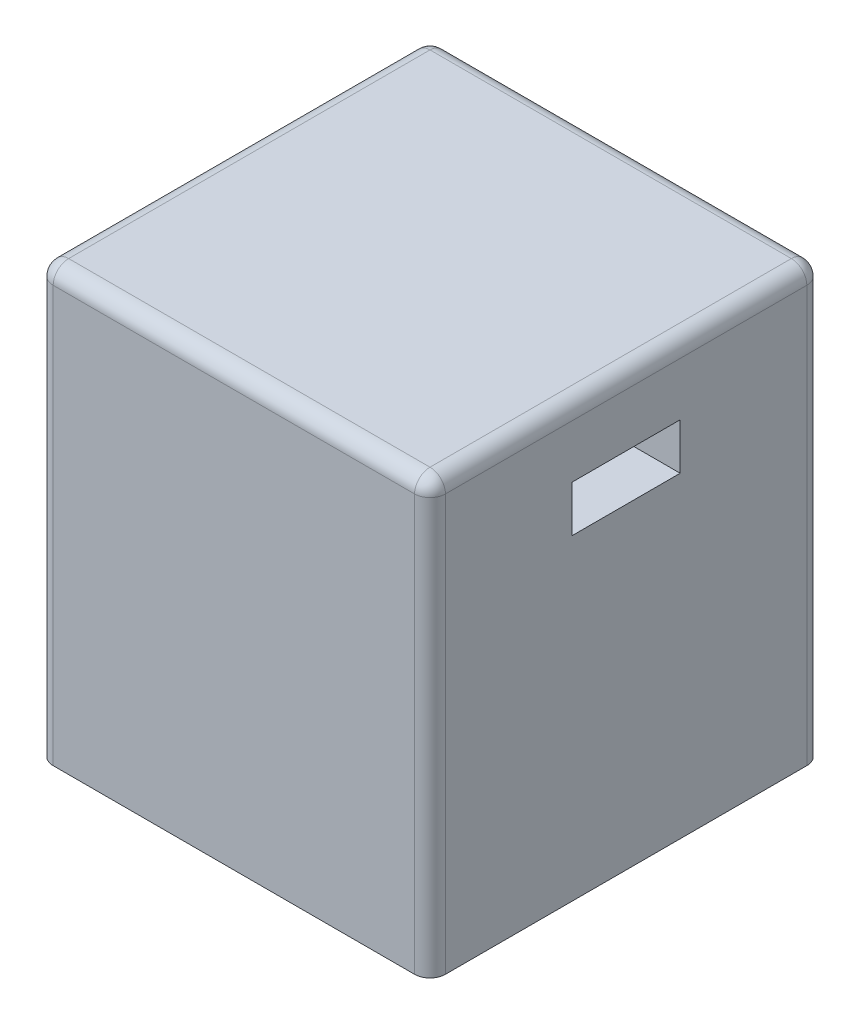
ISO-10303-21;
HEADER;
FILE_DESCRIPTION(('STEP AP214'),'2;1');
FILE_NAME('part.step','',(''),(''),'','','');
FILE_SCHEMA(('AUTOMOTIVE_DESIGN { 1 0 10303 214 1 1 1 1 }'));
ENDSEC;
DATA;
#1=APPLICATION_CONTEXT('core data for automotive mechanical design processes');
#2=APPLICATION_PROTOCOL_DEFINITION('international standard','automotive_design',2000,#1);
#3=PRODUCT_CONTEXT('',#1,'mechanical');
#4=PRODUCT('Part','Part','',(#3));
#5=PRODUCT_RELATED_PRODUCT_CATEGORY('part','',(#4));
#6=PRODUCT_DEFINITION_FORMATION('','',#4);
#7=PRODUCT_DEFINITION_CONTEXT('part definition',#1,'design');
#8=PRODUCT_DEFINITION('design','',#6,#7);
#9=PRODUCT_DEFINITION_SHAPE('','',#8);
#10=(LENGTH_UNIT() NAMED_UNIT(*) SI_UNIT(.MILLI.,.METRE.));
#11=(NAMED_UNIT(*) PLANE_ANGLE_UNIT() SI_UNIT($,.RADIAN.));
#12=(NAMED_UNIT(*) SI_UNIT($,.STERADIAN.) SOLID_ANGLE_UNIT());
#13=UNCERTAINTY_MEASURE_WITH_UNIT(LENGTH_MEASURE(1.E-05),#10,'distance_accuracy_value','');
#14=(GEOMETRIC_REPRESENTATION_CONTEXT(3) GLOBAL_UNCERTAINTY_ASSIGNED_CONTEXT((#13)) GLOBAL_UNIT_ASSIGNED_CONTEXT((#10,
#11,#12)) REPRESENTATION_CONTEXT('',''));
#15=CARTESIAN_POINT('',(0.,0.,0.));
#16=DIRECTION('',(0.,0.,1.));
#17=DIRECTION('',(1.,0.,0.));
#18=AXIS2_PLACEMENT_3D('',#15,#16,#17);
#19=CARTESIAN_POINT('',(12.7,13.97,12.7));
#20=DIRECTION('',(-1.,0.,0.));
#21=DIRECTION('',(0.,0.,1.));
#22=AXIS2_PLACEMENT_3D('',#19,#20,#21);
#23=PLANE('',#22);
#24=DIRECTION('',(0.,0.,-1.));
#25=VECTOR('',#24,1.);
#26=CARTESIAN_POINT('',(12.7,-13.97,12.7));
#27=LINE('',#26,#25);
#28=CARTESIAN_POINT('',(12.7,-13.97,11.7));
#29=VERTEX_POINT('',#28);
#30=CARTESIAN_POINT('',(12.7,-13.97,-11.7));
#31=VERTEX_POINT('',#30);
#32=EDGE_CURVE('E235',#29,#31,#27,.T.);
#33=ORIENTED_EDGE('',*,*,#32,.T.);
#34=DIRECTION('',(0.,-1.,0.));
#35=VECTOR('',#34,1.);
#36=CARTESIAN_POINT('',(12.7,13.97,-11.7));
#37=LINE('',#36,#35);
#38=CARTESIAN_POINT('',(12.7,12.97,-11.7));
#39=VERTEX_POINT('',#38);
#40=EDGE_CURVE('E282',#31,#39,#37,.F.);
#41=ORIENTED_EDGE('',*,*,#40,.T.);
#42=DIRECTION('',(0.,0.,-1.));
#43=VECTOR('',#42,1.);
#44=CARTESIAN_POINT('',(12.7,12.97,12.7));
#45=LINE('',#44,#43);
#46=CARTESIAN_POINT('',(12.7,12.97,11.7));
#47=VERTEX_POINT('',#46);
#48=EDGE_CURVE('E276',#39,#47,#45,.F.);
#49=ORIENTED_EDGE('',*,*,#48,.T.);
#50=DIRECTION('',(0.,-1.,0.));
#51=VECTOR('',#50,1.);
#52=CARTESIAN_POINT('',(12.7,13.97,11.7));
#53=LINE('',#52,#51);
#54=EDGE_CURVE('E279',#47,#29,#53,.T.);
#55=ORIENTED_EDGE('',*,*,#54,.T.);
#56=EDGE_LOOP('',(#33,#41,#49,#55));
#57=FACE_BOUND('',#56,.T.);
#58=DIRECTION('',(0.,0.,1.));
#59=VECTOR('',#58,1.);
#60=CARTESIAN_POINT('',(12.7,9.53,3.5));
#61=LINE('',#60,#59);
#62=CARTESIAN_POINT('',(12.7,9.53,-3.5));
#63=VERTEX_POINT('',#62);
#64=CARTESIAN_POINT('',(12.7,9.53,3.5));
#65=VERTEX_POINT('',#64);
#66=EDGE_CURVE('E192',#63,#65,#61,.T.);
#67=ORIENTED_EDGE('',*,*,#66,.F.);
#68=DIRECTION('',(0.,1.,0.));
#69=VECTOR('',#68,1.);
#70=CARTESIAN_POINT('',(12.7,6.53,-3.5));
#71=LINE('',#70,#69);
#72=CARTESIAN_POINT('',(12.7,6.53,-3.5));
#73=VERTEX_POINT('',#72);
#74=EDGE_CURVE('E158',#73,#63,#71,.T.);
#75=ORIENTED_EDGE('',*,*,#74,.F.);
#76=DIRECTION('',(0.,0.,-1.));
#77=VECTOR('',#76,1.);
#78=CARTESIAN_POINT('',(12.7,6.53,3.5));
#79=LINE('',#78,#77);
#80=CARTESIAN_POINT('',(12.7,6.53,3.5));
#81=VERTEX_POINT('',#80);
#82=EDGE_CURVE('E179',#81,#73,#79,.T.);
#83=ORIENTED_EDGE('',*,*,#82,.F.);
#84=DIRECTION('',(0.,-1.,0.));
#85=VECTOR('',#84,1.);
#86=CARTESIAN_POINT('',(12.7,6.53,3.5));
#87=LINE('',#86,#85);
#88=EDGE_CURVE('E183',#65,#81,#87,.T.);
#89=ORIENTED_EDGE('',*,*,#88,.F.);
#90=EDGE_LOOP('',(#67,#75,#83,#89));
#91=FACE_BOUND('',#90,.T.);
#92=ADVANCED_FACE('F45',(#57,#91),#23,.F.);
#93=CARTESIAN_POINT('',(-12.7,13.97,-12.7));
#94=DIRECTION('',(0.,0.,1.));
#95=DIRECTION('',(1.,0.,0.));
#96=AXIS2_PLACEMENT_3D('',#93,#94,#95);
#97=PLANE('',#96);
#98=DIRECTION('',(-1.,0.,0.));
#99=VECTOR('',#98,1.);
#100=CARTESIAN_POINT('',(-12.7,12.97,-12.7));
#101=LINE('',#100,#99);
#102=CARTESIAN_POINT('',(-11.7,12.97,-12.7));
#103=VERTEX_POINT('',#102);
#104=CARTESIAN_POINT('',(11.7,12.97,-12.7));
#105=VERTEX_POINT('',#104);
#106=EDGE_CURVE('E254',#103,#105,#101,.F.);
#107=ORIENTED_EDGE('',*,*,#106,.T.);
#108=DIRECTION('',(0.,-1.,0.));
#109=VECTOR('',#108,1.);
#110=CARTESIAN_POINT('',(11.7,13.97,-12.7));
#111=LINE('',#110,#109);
#112=CARTESIAN_POINT('',(11.7,-13.97,-12.7));
#113=VERTEX_POINT('',#112);
#114=EDGE_CURVE('E260',#105,#113,#111,.T.);
#115=ORIENTED_EDGE('',*,*,#114,.T.);
#116=DIRECTION('',(-1.,0.,0.));
#117=VECTOR('',#116,1.);
#118=CARTESIAN_POINT('',(-12.7,-13.97,-12.7));
#119=LINE('',#118,#117);
#120=CARTESIAN_POINT('',(-11.7,-13.97,-12.7));
#121=VERTEX_POINT('',#120);
#122=EDGE_CURVE('E242',#113,#121,#119,.T.);
#123=ORIENTED_EDGE('',*,*,#122,.T.);
#124=DIRECTION('',(0.,-1.,0.));
#125=VECTOR('',#124,1.);
#126=CARTESIAN_POINT('',(-11.7,13.97,-12.7));
#127=LINE('',#126,#125);
#128=EDGE_CURVE('E257',#121,#103,#127,.F.);
#129=ORIENTED_EDGE('',*,*,#128,.T.);
#130=EDGE_LOOP('',(#107,#115,#123,#129));
#131=FACE_BOUND('',#130,.T.);
#132=ADVANCED_FACE('F399',(#131),#97,.F.);
#133=CARTESIAN_POINT('',(-12.7,13.97,12.7));
#134=DIRECTION('',(1.,0.,0.));
#135=DIRECTION('',(0.,0.,-1.));
#136=AXIS2_PLACEMENT_3D('',#133,#134,#135);
#137=PLANE('',#136);
#138=DIRECTION('',(0.,0.,-1.));
#139=VECTOR('',#138,1.);
#140=CARTESIAN_POINT('',(-12.7,6.53,3.5));
#141=LINE('',#140,#139);
#142=CARTESIAN_POINT('',(-12.7,6.53,3.5));
#143=VERTEX_POINT('',#142);
#144=CARTESIAN_POINT('',(-12.7,6.53,-3.5));
#145=VERTEX_POINT('',#144);
#146=EDGE_CURVE('E164',#143,#145,#141,.T.);
#147=ORIENTED_EDGE('',*,*,#146,.T.);
#148=DIRECTION('',(0.,1.,0.));
#149=VECTOR('',#148,1.);
#150=CARTESIAN_POINT('',(-12.7,6.53,-3.5));
#151=LINE('',#150,#149);
#152=CARTESIAN_POINT('',(-12.7,9.53,-3.5));
#153=VERTEX_POINT('',#152);
#154=EDGE_CURVE('E155',#145,#153,#151,.T.);
#155=ORIENTED_EDGE('',*,*,#154,.T.);
#156=DIRECTION('',(0.,0.,1.));
#157=VECTOR('',#156,1.);
#158=CARTESIAN_POINT('',(-12.7,9.53,3.5));
#159=LINE('',#158,#157);
#160=CARTESIAN_POINT('',(-12.7,9.53,3.5));
#161=VERTEX_POINT('',#160);
#162=EDGE_CURVE('E168',#153,#161,#159,.T.);
#163=ORIENTED_EDGE('',*,*,#162,.T.);
#164=DIRECTION('',(0.,-1.,0.));
#165=VECTOR('',#164,1.);
#166=CARTESIAN_POINT('',(-12.7,6.53,3.5));
#167=LINE('',#166,#165);
#168=EDGE_CURVE('E173',#161,#143,#167,.T.);
#169=ORIENTED_EDGE('',*,*,#168,.T.);
#170=EDGE_LOOP('',(#147,#155,#163,#169));
#171=FACE_BOUND('',#170,.T.);
#172=DIRECTION('',(0.,0.,1.));
#173=VECTOR('',#172,1.);
#174=CARTESIAN_POINT('',(-12.7,12.97,12.7));
#175=LINE('',#174,#173);
#176=CARTESIAN_POINT('',(-12.7,12.97,11.7));
#177=VERTEX_POINT('',#176);
#178=CARTESIAN_POINT('',(-12.7,12.97,-11.7));
#179=VERTEX_POINT('',#178);
#180=EDGE_CURVE('E285',#177,#179,#175,.F.);
#181=ORIENTED_EDGE('',*,*,#180,.T.);
#182=DIRECTION('',(0.,-1.,0.));
#183=VECTOR('',#182,1.);
#184=CARTESIAN_POINT('',(-12.7,13.97,-11.7));
#185=LINE('',#184,#183);
#186=CARTESIAN_POINT('',(-12.7,-13.97,-11.7));
#187=VERTEX_POINT('',#186);
#188=EDGE_CURVE('E291',#179,#187,#185,.T.);
#189=ORIENTED_EDGE('',*,*,#188,.T.);
#190=DIRECTION('',(0.,0.,1.));
#191=VECTOR('',#190,1.);
#192=CARTESIAN_POINT('',(-12.7,-13.97,12.7));
#193=LINE('',#192,#191);
#194=CARTESIAN_POINT('',(-12.7,-13.97,11.7));
#195=VERTEX_POINT('',#194);
#196=EDGE_CURVE('E246',#187,#195,#193,.T.);
#197=ORIENTED_EDGE('',*,*,#196,.T.);
#198=DIRECTION('',(0.,-1.,0.));
#199=VECTOR('',#198,1.);
#200=CARTESIAN_POINT('',(-12.7,13.97,11.7));
#201=LINE('',#200,#199);
#202=EDGE_CURVE('E288',#195,#177,#201,.F.);
#203=ORIENTED_EDGE('',*,*,#202,.T.);
#204=EDGE_LOOP('',(#181,#189,#197,#203));
#205=FACE_BOUND('',#204,.T.);
#206=ADVANCED_FACE('F175',(#171,#205),#137,.F.);
#207=CARTESIAN_POINT('',(-12.7,13.97,12.7));
#208=DIRECTION('',(0.,0.,-1.));
#209=DIRECTION('',(-1.,0.,0.));
#210=AXIS2_PLACEMENT_3D('',#207,#208,#209);
#211=PLANE('',#210);
#212=DIRECTION('',(1.,0.,0.));
#213=VECTOR('',#212,1.);
#214=CARTESIAN_POINT('',(-12.7,-13.97,12.7));
#215=LINE('',#214,#213);
#216=CARTESIAN_POINT('',(-11.7,-13.97,12.7));
#217=VERTEX_POINT('',#216);
#218=CARTESIAN_POINT('',(11.7,-13.97,12.7));
#219=VERTEX_POINT('',#218);
#220=EDGE_CURVE('E250',#217,#219,#215,.T.);
#221=ORIENTED_EDGE('',*,*,#220,.T.);
#222=DIRECTION('',(0.,-1.,0.));
#223=VECTOR('',#222,1.);
#224=CARTESIAN_POINT('',(11.7,13.97,12.7));
#225=LINE('',#224,#223);
#226=CARTESIAN_POINT('',(11.7,12.97,12.7));
#227=VERTEX_POINT('',#226);
#228=EDGE_CURVE('E300',#219,#227,#225,.F.);
#229=ORIENTED_EDGE('',*,*,#228,.T.);
#230=DIRECTION('',(1.,0.,0.));
#231=VECTOR('',#230,1.);
#232=CARTESIAN_POINT('',(-12.7,12.97,12.7));
#233=LINE('',#232,#231);
#234=CARTESIAN_POINT('',(-11.7,12.97,12.7));
#235=VERTEX_POINT('',#234);
#236=EDGE_CURVE('E294',#227,#235,#233,.F.);
#237=ORIENTED_EDGE('',*,*,#236,.T.);
#238=DIRECTION('',(0.,-1.,0.));
#239=VECTOR('',#238,1.);
#240=CARTESIAN_POINT('',(-11.7,13.97,12.7));
#241=LINE('',#240,#239);
#242=EDGE_CURVE('E297',#235,#217,#241,.T.);
#243=ORIENTED_EDGE('',*,*,#242,.T.);
#244=EDGE_LOOP('',(#221,#229,#237,#243));
#245=FACE_BOUND('',#244,.T.);
#246=ADVANCED_FACE('F365',(#245),#211,.F.);
#247=CARTESIAN_POINT('',(0.,13.97,0.));
#248=DIRECTION('',(0.,-1.,0.));
#249=DIRECTION('',(0.,0.,-1.));
#250=AXIS2_PLACEMENT_3D('',#247,#248,#249);
#251=PLANE('',#250);
#252=DIRECTION('',(1.,0.,0.));
#253=VECTOR('',#252,1.);
#254=CARTESIAN_POINT('',(0.,13.97,11.7));
#255=LINE('',#254,#253);
#256=CARTESIAN_POINT('',(-11.7,13.97,11.7));
#257=VERTEX_POINT('',#256);
#258=CARTESIAN_POINT('',(11.7,13.97,11.7));
#259=VERTEX_POINT('',#258);
#260=EDGE_CURVE('E70',#257,#259,#255,.T.);
#261=ORIENTED_EDGE('',*,*,#260,.T.);
#262=DIRECTION('',(0.,0.,-1.));
#263=VECTOR('',#262,1.);
#264=CARTESIAN_POINT('',(11.7,13.97,0.));
#265=LINE('',#264,#263);
#266=CARTESIAN_POINT('',(11.7,13.97,-11.7));
#267=VERTEX_POINT('',#266);
#268=EDGE_CURVE('E11',#259,#267,#265,.T.);
#269=ORIENTED_EDGE('',*,*,#268,.T.);
#270=DIRECTION('',(-1.,0.,0.));
#271=VECTOR('',#270,1.);
#272=CARTESIAN_POINT('',(0.,13.97,-11.7));
#273=LINE('',#272,#271);
#274=CARTESIAN_POINT('',(-11.7,13.97,-11.7));
#275=VERTEX_POINT('',#274);
#276=EDGE_CURVE('E55',#267,#275,#273,.T.);
#277=ORIENTED_EDGE('',*,*,#276,.T.);
#278=DIRECTION('',(0.,0.,1.));
#279=VECTOR('',#278,1.);
#280=CARTESIAN_POINT('',(-11.7,13.97,0.));
#281=LINE('',#280,#279);
#282=EDGE_CURVE('E303',#275,#257,#281,.T.);
#283=ORIENTED_EDGE('',*,*,#282,.T.);
#284=EDGE_LOOP('',(#261,#269,#277,#283));
#285=FACE_BOUND('',#284,.T.);
#286=ADVANCED_FACE('F386',(#285),#251,.F.);
#287=CARTESIAN_POINT('',(0.,-13.97,0.));
#288=DIRECTION('',(0.,-1.,0.));
#289=DIRECTION('',(0.,0.,-1.));
#290=AXIS2_PLACEMENT_3D('',#287,#288,#289);
#291=PLANE('',#290);
#292=CARTESIAN_POINT('',(-6.35,-13.97,-6.35));
#293=DIRECTION('',(0.,-1.,0.));
#294=DIRECTION('',(0.,0.,-1.));
#295=AXIS2_PLACEMENT_3D('',#292,#293,#294);
#296=CIRCLE('',#295,1.5);
#297=CARTESIAN_POINT('',(-6.35,-13.97,-7.85));
#298=VERTEX_POINT('',#297);
#299=EDGE_CURVE('E224',#298,#298,#296,.T.);
#300=ORIENTED_EDGE('',*,*,#299,.F.);
#301=EDGE_LOOP('',(#300));
#302=FACE_BOUND('',#301,.T.);
#303=CARTESIAN_POINT('',(6.35,-13.97,-6.35));
#304=DIRECTION('',(0.,-1.,0.));
#305=DIRECTION('',(0.,0.,-1.));
#306=AXIS2_PLACEMENT_3D('',#303,#304,#305);
#307=CIRCLE('',#306,1.5);
#308=CARTESIAN_POINT('',(6.35,-13.97,-7.85));
#309=VERTEX_POINT('',#308);
#310=EDGE_CURVE('E216',#309,#309,#307,.T.);
#311=ORIENTED_EDGE('',*,*,#310,.F.);
#312=EDGE_LOOP('',(#311));
#313=FACE_BOUND('',#312,.T.);
#314=CARTESIAN_POINT('',(6.35,-13.97,6.35));
#315=DIRECTION('',(0.,-1.,0.));
#316=DIRECTION('',(0.,0.,-1.));
#317=AXIS2_PLACEMENT_3D('',#314,#315,#316);
#318=CIRCLE('',#317,1.5);
#319=CARTESIAN_POINT('',(6.35,-13.97,4.85));
#320=VERTEX_POINT('',#319);
#321=EDGE_CURVE('E207',#320,#320,#318,.T.);
#322=ORIENTED_EDGE('',*,*,#321,.F.);
#323=EDGE_LOOP('',(#322));
#324=FACE_BOUND('',#323,.T.);
#325=CARTESIAN_POINT('',(-6.35000000000001,-13.97,6.35));
#326=DIRECTION('',(0.,-1.,0.));
#327=DIRECTION('',(0.,0.,-1.));
#328=AXIS2_PLACEMENT_3D('',#325,#326,#327);
#329=CIRCLE('',#328,1.5);
#330=CARTESIAN_POINT('',(-6.35000000000001,-13.97,4.85));
#331=VERTEX_POINT('',#330);
#332=EDGE_CURVE('E211',#331,#331,#329,.T.);
#333=ORIENTED_EDGE('',*,*,#332,.F.);
#334=EDGE_LOOP('',(#333));
#335=FACE_BOUND('',#334,.T.);
#336=ORIENTED_EDGE('',*,*,#122,.F.);
#337=CARTESIAN_POINT('',(11.7,-13.97,-11.7));
#338=DIRECTION('',(0.,-1.,0.));
#339=DIRECTION('',(0.,0.,-1.));
#340=AXIS2_PLACEMENT_3D('',#337,#338,#339);
#341=CIRCLE('',#340,1.);
#342=EDGE_CURVE('E273',#113,#31,#341,.T.);
#343=ORIENTED_EDGE('',*,*,#342,.T.);
#344=ORIENTED_EDGE('',*,*,#32,.F.);
#345=CARTESIAN_POINT('',(11.7,-13.97,11.7));
#346=DIRECTION('',(0.,-1.,0.));
#347=DIRECTION('',(0.,0.,-1.));
#348=AXIS2_PLACEMENT_3D('',#345,#346,#347);
#349=CIRCLE('',#348,1.);
#350=EDGE_CURVE('E267',#29,#219,#349,.T.);
#351=ORIENTED_EDGE('',*,*,#350,.T.);
#352=ORIENTED_EDGE('',*,*,#220,.F.);
#353=CARTESIAN_POINT('',(-11.7,-13.97,11.7));
#354=DIRECTION('',(0.,-1.,0.));
#355=DIRECTION('',(0.,0.,-1.));
#356=AXIS2_PLACEMENT_3D('',#353,#354,#355);
#357=CIRCLE('',#356,1.);
#358=EDGE_CURVE('E264',#217,#195,#357,.T.);
#359=ORIENTED_EDGE('',*,*,#358,.T.);
#360=ORIENTED_EDGE('',*,*,#196,.F.);
#361=CARTESIAN_POINT('',(-11.7,-13.97,-11.7));
#362=DIRECTION('',(0.,-1.,0.));
#363=DIRECTION('',(0.,0.,-1.));
#364=AXIS2_PLACEMENT_3D('',#361,#362,#363);
#365=CIRCLE('',#364,1.);
#366=EDGE_CURVE('E270',#187,#121,#365,.T.);
#367=ORIENTED_EDGE('',*,*,#366,.T.);
#368=EDGE_LOOP('',(#336,#343,#344,#351,#352,#359,#360,#367));
#369=FACE_BOUND('',#368,.T.);
#370=ADVANCED_FACE('F369',(#302,#313,#324,#335,#369),#291,.T.);
#371=CARTESIAN_POINT('',(-6.35000000000001,-8.89,6.35));
#372=DIRECTION('',(0.,-1.,0.));
#373=DIRECTION('',(0.,0.,-1.));
#374=AXIS2_PLACEMENT_3D('',#371,#372,#373);
#375=CYLINDRICAL_SURFACE('',#374,1.5);
#376=CARTESIAN_POINT('',(-6.35000000000001,-8.89,6.35));
#377=DIRECTION('',(0.,-1.,0.));
#378=DIRECTION('',(0.,0.,-1.));
#379=AXIS2_PLACEMENT_3D('',#376,#377,#378);
#380=CIRCLE('',#379,1.5);
#381=CARTESIAN_POINT('',(-6.35000000000001,-8.89,4.85));
#382=VERTEX_POINT('',#381);
#383=EDGE_CURVE('E231',#382,#382,#380,.T.);
#384=ORIENTED_EDGE('',*,*,#383,.F.);
#385=EDGE_LOOP('',(#384));
#386=FACE_BOUND('',#385,.T.);
#387=ORIENTED_EDGE('',*,*,#332,.T.);
#388=EDGE_LOOP('',(#387));
#389=FACE_BOUND('',#388,.T.);
#390=ADVANCED_FACE('F434',(#386,#389),#375,.F.);
#391=CARTESIAN_POINT('',(-6.35000000000001,-8.89,6.35));
#392=DIRECTION('',(0.,-1.,0.));
#393=DIRECTION('',(0.,0.,-1.));
#394=AXIS2_PLACEMENT_3D('',#391,#392,#393);
#395=PLANE('',#394);
#396=ORIENTED_EDGE('',*,*,#383,.T.);
#397=EDGE_LOOP('',(#396));
#398=FACE_BOUND('',#397,.T.);
#399=ADVANCED_FACE('F440',(#398),#395,.T.);
#400=CARTESIAN_POINT('',(6.35,-8.89,6.35));
#401=DIRECTION('',(0.,-1.,0.));
#402=DIRECTION('',(0.,0.,-1.));
#403=AXIS2_PLACEMENT_3D('',#400,#401,#402);
#404=CYLINDRICAL_SURFACE('',#403,1.5);
#405=CARTESIAN_POINT('',(6.35,-8.89,6.35));
#406=DIRECTION('',(0.,-1.,0.));
#407=DIRECTION('',(0.,0.,-1.));
#408=AXIS2_PLACEMENT_3D('',#405,#406,#407);
#409=CIRCLE('',#408,1.5);
#410=CARTESIAN_POINT('',(6.35,-8.89,4.85));
#411=VERTEX_POINT('',#410);
#412=EDGE_CURVE('E212',#411,#411,#409,.T.);
#413=ORIENTED_EDGE('',*,*,#412,.F.);
#414=EDGE_LOOP('',(#413));
#415=FACE_BOUND('',#414,.T.);
#416=ORIENTED_EDGE('',*,*,#321,.T.);
#417=EDGE_LOOP('',(#416));
#418=FACE_BOUND('',#417,.T.);
#419=ADVANCED_FACE('F444',(#415,#418),#404,.F.);
#420=CARTESIAN_POINT('',(6.35,-8.89,6.35));
#421=DIRECTION('',(0.,-1.,0.));
#422=DIRECTION('',(0.,0.,-1.));
#423=AXIS2_PLACEMENT_3D('',#420,#421,#422);
#424=PLANE('',#423);
#425=ORIENTED_EDGE('',*,*,#412,.T.);
#426=EDGE_LOOP('',(#425));
#427=FACE_BOUND('',#426,.T.);
#428=ADVANCED_FACE('F461',(#427),#424,.T.);
#429=CARTESIAN_POINT('',(6.35,-8.89,-6.35));
#430=DIRECTION('',(0.,-1.,0.));
#431=DIRECTION('',(0.,0.,-1.));
#432=AXIS2_PLACEMENT_3D('',#429,#430,#431);
#433=CYLINDRICAL_SURFACE('',#432,1.5);
#434=CARTESIAN_POINT('',(6.35,-8.89,-6.35));
#435=DIRECTION('',(0.,-1.,0.));
#436=DIRECTION('',(0.,0.,-1.));
#437=AXIS2_PLACEMENT_3D('',#434,#435,#436);
#438=CIRCLE('',#437,1.5);
#439=CARTESIAN_POINT('',(6.35,-8.89,-7.85));
#440=VERTEX_POINT('',#439);
#441=EDGE_CURVE('E220',#440,#440,#438,.T.);
#442=ORIENTED_EDGE('',*,*,#441,.F.);
#443=EDGE_LOOP('',(#442));
#444=FACE_BOUND('',#443,.T.);
#445=ORIENTED_EDGE('',*,*,#310,.T.);
#446=EDGE_LOOP('',(#445));
#447=FACE_BOUND('',#446,.T.);
#448=ADVANCED_FACE('F457',(#444,#447),#433,.F.);
#449=CARTESIAN_POINT('',(6.35,-8.89,-6.35));
#450=DIRECTION('',(0.,-1.,0.));
#451=DIRECTION('',(0.,0.,-1.));
#452=AXIS2_PLACEMENT_3D('',#449,#450,#451);
#453=PLANE('',#452);
#454=ORIENTED_EDGE('',*,*,#441,.T.);
#455=EDGE_LOOP('',(#454));
#456=FACE_BOUND('',#455,.T.);
#457=ADVANCED_FACE('F453',(#456),#453,.T.);
#458=CARTESIAN_POINT('',(-6.35,-8.89,-6.35));
#459=DIRECTION('',(0.,-1.,0.));
#460=DIRECTION('',(0.,0.,-1.));
#461=AXIS2_PLACEMENT_3D('',#458,#459,#460);
#462=CYLINDRICAL_SURFACE('',#461,1.5);
#463=CARTESIAN_POINT('',(-6.35,-8.89,-6.35));
#464=DIRECTION('',(0.,-1.,0.));
#465=DIRECTION('',(0.,0.,-1.));
#466=AXIS2_PLACEMENT_3D('',#463,#464,#465);
#467=CIRCLE('',#466,1.5);
#468=CARTESIAN_POINT('',(-6.35,-8.89,-7.85));
#469=VERTEX_POINT('',#468);
#470=EDGE_CURVE('E201',#469,#469,#467,.T.);
#471=ORIENTED_EDGE('',*,*,#470,.F.);
#472=EDGE_LOOP('',(#471));
#473=FACE_BOUND('',#472,.T.);
#474=ORIENTED_EDGE('',*,*,#299,.T.);
#475=EDGE_LOOP('',(#474));
#476=FACE_BOUND('',#475,.T.);
#477=ADVANCED_FACE('F449',(#473,#476),#462,.F.);
#478=CARTESIAN_POINT('',(-6.35,-8.89,-6.35));
#479=DIRECTION('',(0.,-1.,0.));
#480=DIRECTION('',(0.,0.,-1.));
#481=AXIS2_PLACEMENT_3D('',#478,#479,#480);
#482=PLANE('',#481);
#483=ORIENTED_EDGE('',*,*,#470,.T.);
#484=EDGE_LOOP('',(#483));
#485=FACE_BOUND('',#484,.T.);
#486=ADVANCED_FACE('F446',(#485),#482,.T.);
#487=CARTESIAN_POINT('',(-12.7,6.53,-3.5));
#488=DIRECTION('',(0.,0.,-1.));
#489=DIRECTION('',(0.,1.,0.));
#490=AXIS2_PLACEMENT_3D('',#487,#488,#489);
#491=PLANE('',#490);
#492=ORIENTED_EDGE('',*,*,#74,.T.);
#493=DIRECTION('',(1.,0.,0.));
#494=VECTOR('',#493,1.);
#495=CARTESIAN_POINT('',(-12.7,9.53,-3.5));
#496=LINE('',#495,#494);
#497=EDGE_CURVE('E151',#153,#63,#496,.T.);
#498=ORIENTED_EDGE('',*,*,#497,.F.);
#499=ORIENTED_EDGE('',*,*,#154,.F.);
#500=DIRECTION('',(1.,0.,0.));
#501=VECTOR('',#500,1.);
#502=CARTESIAN_POINT('',(-12.7,6.53,-3.5));
#503=LINE('',#502,#501);
#504=EDGE_CURVE('E198',#145,#73,#503,.T.);
#505=ORIENTED_EDGE('',*,*,#504,.T.);
#506=EDGE_LOOP('',(#492,#498,#499,#505));
#507=FACE_BOUND('',#506,.T.);
#508=ADVANCED_FACE('F153',(#507),#491,.F.);
#509=CARTESIAN_POINT('',(-12.7,6.53,3.5));
#510=DIRECTION('',(0.,-1.,0.));
#511=DIRECTION('',(0.,0.,-1.));
#512=AXIS2_PLACEMENT_3D('',#509,#510,#511);
#513=PLANE('',#512);
#514=ORIENTED_EDGE('',*,*,#82,.T.);
#515=ORIENTED_EDGE('',*,*,#504,.F.);
#516=ORIENTED_EDGE('',*,*,#146,.F.);
#517=DIRECTION('',(1.,0.,0.));
#518=VECTOR('',#517,1.);
#519=CARTESIAN_POINT('',(-12.7,6.53,3.5));
#520=LINE('',#519,#518);
#521=EDGE_CURVE('E202',#143,#81,#520,.T.);
#522=ORIENTED_EDGE('',*,*,#521,.T.);
#523=EDGE_LOOP('',(#514,#515,#516,#522));
#524=FACE_BOUND('',#523,.T.);
#525=ADVANCED_FACE('F471',(#524),#513,.F.);
#526=CARTESIAN_POINT('',(-12.7,6.53,3.5));
#527=DIRECTION('',(0.,0.,1.));
#528=DIRECTION('',(1.,0.,0.));
#529=AXIS2_PLACEMENT_3D('',#526,#527,#528);
#530=PLANE('',#529);
#531=ORIENTED_EDGE('',*,*,#88,.T.);
#532=ORIENTED_EDGE('',*,*,#521,.F.);
#533=ORIENTED_EDGE('',*,*,#168,.F.);
#534=DIRECTION('',(1.,0.,0.));
#535=VECTOR('',#534,1.);
#536=CARTESIAN_POINT('',(-12.7,9.53,3.5));
#537=LINE('',#536,#535);
#538=EDGE_CURVE('E163',#161,#65,#537,.T.);
#539=ORIENTED_EDGE('',*,*,#538,.T.);
#540=EDGE_LOOP('',(#531,#532,#533,#539));
#541=FACE_BOUND('',#540,.T.);
#542=ADVANCED_FACE('F473',(#541),#530,.F.);
#543=CARTESIAN_POINT('',(-12.7,9.53,3.5));
#544=DIRECTION('',(0.,1.,0.));
#545=DIRECTION('',(0.,0.,1.));
#546=AXIS2_PLACEMENT_3D('',#543,#544,#545);
#547=PLANE('',#546);
#548=ORIENTED_EDGE('',*,*,#66,.T.);
#549=ORIENTED_EDGE('',*,*,#538,.F.);
#550=ORIENTED_EDGE('',*,*,#162,.F.);
#551=ORIENTED_EDGE('',*,*,#497,.T.);
#552=EDGE_LOOP('',(#548,#549,#550,#551));
#553=FACE_BOUND('',#552,.T.);
#554=ADVANCED_FACE('F169',(#553),#547,.F.);
#555=CARTESIAN_POINT('',(-11.7,13.97,11.7));
#556=DIRECTION('',(0.,-1.,0.));
#557=DIRECTION('',(0.,0.,-1.));
#558=AXIS2_PLACEMENT_3D('',#555,#556,#557);
#559=CYLINDRICAL_SURFACE('',#558,1.);
#560=CARTESIAN_POINT('',(-11.7,12.97,11.7));
#561=DIRECTION('',(0.,1.,0.));
#562=DIRECTION('',(0.,0.,1.));
#563=AXIS2_PLACEMENT_3D('',#560,#561,#562);
#564=CIRCLE('',#563,1.);
#565=EDGE_CURVE('E49',#177,#235,#564,.T.);
#566=ORIENTED_EDGE('',*,*,#565,.F.);
#567=ORIENTED_EDGE('',*,*,#202,.F.);
#568=ORIENTED_EDGE('',*,*,#358,.F.);
#569=ORIENTED_EDGE('',*,*,#242,.F.);
#570=EDGE_LOOP('',(#566,#567,#568,#569));
#571=FACE_BOUND('',#570,.T.);
#572=ADVANCED_FACE('F47',(#571),#559,.T.);
#573=CARTESIAN_POINT('',(-11.7,12.97,11.7));
#574=DIRECTION('',(0.,0.,1.));
#575=DIRECTION('',(1.,0.,0.));
#576=AXIS2_PLACEMENT_3D('',#573,#574,#575);
#577=SPHERICAL_SURFACE('',#576,1.);
#578=CARTESIAN_POINT('',(-11.7,12.97,11.7));
#579=DIRECTION('',(0.,0.,1.));
#580=DIRECTION('',(1.,0.,0.));
#581=AXIS2_PLACEMENT_3D('',#578,#579,#580);
#582=CIRCLE('',#581,1.);
#583=EDGE_CURVE('E343',#177,#257,#582,.F.);
#584=ORIENTED_EDGE('',*,*,#583,.F.);
#585=ORIENTED_EDGE('',*,*,#565,.T.);
#586=CARTESIAN_POINT('',(-11.7,12.97,11.7));
#587=DIRECTION('',(-1.,0.,0.));
#588=DIRECTION('',(0.,0.,1.));
#589=AXIS2_PLACEMENT_3D('',#586,#587,#588);
#590=CIRCLE('',#589,1.);
#591=EDGE_CURVE('E346',#257,#235,#590,.F.);
#592=ORIENTED_EDGE('',*,*,#591,.F.);
#593=EDGE_LOOP('',(#584,#585,#592));
#594=FACE_BOUND('',#593,.T.);
#595=ADVANCED_FACE('F357',(#594),#577,.T.);
#596=CARTESIAN_POINT('',(11.7,13.97,11.7));
#597=DIRECTION('',(0.,-1.,0.));
#598=DIRECTION('',(0.,0.,-1.));
#599=AXIS2_PLACEMENT_3D('',#596,#597,#598);
#600=CYLINDRICAL_SURFACE('',#599,1.);
#601=ORIENTED_EDGE('',*,*,#350,.F.);
#602=ORIENTED_EDGE('',*,*,#54,.F.);
#603=CARTESIAN_POINT('',(11.7,12.97,11.7));
#604=DIRECTION('',(0.,1.,0.));
#605=DIRECTION('',(0.,0.,1.));
#606=AXIS2_PLACEMENT_3D('',#603,#604,#605);
#607=CIRCLE('',#606,1.);
#608=EDGE_CURVE('E339',#227,#47,#607,.T.);
#609=ORIENTED_EDGE('',*,*,#608,.F.);
#610=ORIENTED_EDGE('',*,*,#228,.F.);
#611=EDGE_LOOP('',(#601,#602,#609,#610));
#612=FACE_BOUND('',#611,.T.);
#613=ADVANCED_FACE('F375',(#612),#600,.T.);
#614=CARTESIAN_POINT('',(0.,12.97,11.7));
#615=DIRECTION('',(1.,0.,0.));
#616=DIRECTION('',(0.,0.,-1.));
#617=AXIS2_PLACEMENT_3D('',#614,#615,#616);
#618=CYLINDRICAL_SURFACE('',#617,1.);
#619=ORIENTED_EDGE('',*,*,#591,.T.);
#620=ORIENTED_EDGE('',*,*,#236,.F.);
#621=CARTESIAN_POINT('',(11.7,12.97,11.7));
#622=DIRECTION('',(1.,0.,0.));
#623=DIRECTION('',(0.,0.,-1.));
#624=AXIS2_PLACEMENT_3D('',#621,#622,#623);
#625=CIRCLE('',#624,1.);
#626=EDGE_CURVE('E335',#259,#227,#625,.T.);
#627=ORIENTED_EDGE('',*,*,#626,.F.);
#628=ORIENTED_EDGE('',*,*,#260,.F.);
#629=EDGE_LOOP('',(#619,#620,#627,#628));
#630=FACE_BOUND('',#629,.T.);
#631=ADVANCED_FACE('F377',(#630),#618,.T.);
#632=CARTESIAN_POINT('',(-11.7,12.97,0.));
#633=DIRECTION('',(0.,0.,1.));
#634=DIRECTION('',(1.,0.,0.));
#635=AXIS2_PLACEMENT_3D('',#632,#633,#634);
#636=CYLINDRICAL_SURFACE('',#635,1.);
#637=ORIENTED_EDGE('',*,*,#583,.T.);
#638=ORIENTED_EDGE('',*,*,#282,.F.);
#639=CARTESIAN_POINT('',(-11.7,12.97,-11.7));
#640=DIRECTION('',(0.,0.,-1.));
#641=DIRECTION('',(-1.,0.,0.));
#642=AXIS2_PLACEMENT_3D('',#639,#640,#641);
#643=CIRCLE('',#642,1.);
#644=EDGE_CURVE('E331',#179,#275,#643,.T.);
#645=ORIENTED_EDGE('',*,*,#644,.F.);
#646=ORIENTED_EDGE('',*,*,#180,.F.);
#647=EDGE_LOOP('',(#637,#638,#645,#646));
#648=FACE_BOUND('',#647,.T.);
#649=ADVANCED_FACE('F391',(#648),#636,.T.);
#650=CARTESIAN_POINT('',(-11.7,13.97,-11.7));
#651=DIRECTION('',(0.,-1.,0.));
#652=DIRECTION('',(0.,0.,-1.));
#653=AXIS2_PLACEMENT_3D('',#650,#651,#652);
#654=CYLINDRICAL_SURFACE('',#653,1.);
#655=ORIENTED_EDGE('',*,*,#366,.F.);
#656=ORIENTED_EDGE('',*,*,#188,.F.);
#657=CARTESIAN_POINT('',(-11.7,12.97,-11.7));
#658=DIRECTION('',(0.,1.,0.));
#659=DIRECTION('',(0.,0.,1.));
#660=AXIS2_PLACEMENT_3D('',#657,#658,#659);
#661=CIRCLE('',#660,1.);
#662=EDGE_CURVE('E327',#103,#179,#661,.T.);
#663=ORIENTED_EDGE('',*,*,#662,.F.);
#664=ORIENTED_EDGE('',*,*,#128,.F.);
#665=EDGE_LOOP('',(#655,#656,#663,#664));
#666=FACE_BOUND('',#665,.T.);
#667=ADVANCED_FACE('F405',(#666),#654,.T.);
#668=CARTESIAN_POINT('',(11.7,12.97,11.7));
#669=DIRECTION('',(0.,0.,1.));
#670=DIRECTION('',(1.,0.,0.));
#671=AXIS2_PLACEMENT_3D('',#668,#669,#670);
#672=SPHERICAL_SURFACE('',#671,1.);
#673=ORIENTED_EDGE('',*,*,#626,.T.);
#674=ORIENTED_EDGE('',*,*,#608,.T.);
#675=CARTESIAN_POINT('',(11.7,12.97,11.7));
#676=DIRECTION('',(0.,0.,1.));
#677=DIRECTION('',(1.,0.,0.));
#678=AXIS2_PLACEMENT_3D('',#675,#676,#677);
#679=CIRCLE('',#678,1.);
#680=EDGE_CURVE('E323',#259,#47,#679,.F.);
#681=ORIENTED_EDGE('',*,*,#680,.F.);
#682=EDGE_LOOP('',(#673,#674,#681));
#683=FACE_BOUND('',#682,.T.);
#684=ADVANCED_FACE('F381',(#683),#672,.T.);
#685=CARTESIAN_POINT('',(-11.7,12.97,-11.7));
#686=DIRECTION('',(-1.,0.,0.));
#687=DIRECTION('',(0.,0.,1.));
#688=AXIS2_PLACEMENT_3D('',#685,#686,#687);
#689=SPHERICAL_SURFACE('',#688,1.);
#690=ORIENTED_EDGE('',*,*,#662,.T.);
#691=ORIENTED_EDGE('',*,*,#644,.T.);
#692=CARTESIAN_POINT('',(-11.7,12.97,-11.7));
#693=DIRECTION('',(-1.,0.,0.));
#694=DIRECTION('',(0.,0.,1.));
#695=AXIS2_PLACEMENT_3D('',#692,#693,#694);
#696=CIRCLE('',#695,1.);
#697=EDGE_CURVE('E319',#103,#275,#696,.F.);
#698=ORIENTED_EDGE('',*,*,#697,.F.);
#699=EDGE_LOOP('',(#690,#691,#698));
#700=FACE_BOUND('',#699,.T.);
#701=ADVANCED_FACE('F394',(#700),#689,.T.);
#702=CARTESIAN_POINT('',(11.7,12.97,0.));
#703=DIRECTION('',(0.,0.,-1.));
#704=DIRECTION('',(-1.,0.,0.));
#705=AXIS2_PLACEMENT_3D('',#702,#703,#704);
#706=CYLINDRICAL_SURFACE('',#705,1.);
#707=ORIENTED_EDGE('',*,*,#680,.T.);
#708=ORIENTED_EDGE('',*,*,#48,.F.);
#709=CARTESIAN_POINT('',(11.7,12.97,-11.7));
#710=DIRECTION('',(0.,0.,-1.));
#711=DIRECTION('',(-1.,0.,0.));
#712=AXIS2_PLACEMENT_3D('',#709,#710,#711);
#713=CIRCLE('',#712,1.);
#714=EDGE_CURVE('E316',#267,#39,#713,.T.);
#715=ORIENTED_EDGE('',*,*,#714,.F.);
#716=ORIENTED_EDGE('',*,*,#268,.F.);
#717=EDGE_LOOP('',(#707,#708,#715,#716));
#718=FACE_BOUND('',#717,.T.);
#719=ADVANCED_FACE('F384',(#718),#706,.T.);
#720=CARTESIAN_POINT('',(0.,12.97,-11.7));
#721=DIRECTION('',(-1.,0.,0.));
#722=DIRECTION('',(0.,0.,1.));
#723=AXIS2_PLACEMENT_3D('',#720,#721,#722);
#724=CYLINDRICAL_SURFACE('',#723,1.);
#725=ORIENTED_EDGE('',*,*,#697,.T.);
#726=ORIENTED_EDGE('',*,*,#276,.F.);
#727=CARTESIAN_POINT('',(11.7,12.97,-11.7));
#728=DIRECTION('',(1.,0.,0.));
#729=DIRECTION('',(0.,1.,0.));
#730=AXIS2_PLACEMENT_3D('',#727,#728,#729);
#731=CIRCLE('',#730,1.);
#732=EDGE_CURVE('E63',#105,#267,#731,.T.);
#733=ORIENTED_EDGE('',*,*,#732,.F.);
#734=ORIENTED_EDGE('',*,*,#106,.F.);
#735=EDGE_LOOP('',(#725,#726,#733,#734));
#736=FACE_BOUND('',#735,.T.);
#737=ADVANCED_FACE('F397',(#736),#724,.T.);
#738=CARTESIAN_POINT('',(11.7,12.97,-11.7));
#739=DIRECTION('',(0.,1.,0.));
#740=DIRECTION('',(0.,0.,1.));
#741=AXIS2_PLACEMENT_3D('',#738,#739,#740);
#742=SPHERICAL_SURFACE('',#741,1.);
#743=ORIENTED_EDGE('',*,*,#732,.T.);
#744=ORIENTED_EDGE('',*,*,#714,.T.);
#745=CARTESIAN_POINT('',(11.7,12.97,-11.7));
#746=DIRECTION('',(0.,1.,0.));
#747=DIRECTION('',(0.,0.,1.));
#748=AXIS2_PLACEMENT_3D('',#745,#746,#747);
#749=CIRCLE('',#748,1.);
#750=EDGE_CURVE('E310',#105,#39,#749,.F.);
#751=ORIENTED_EDGE('',*,*,#750,.F.);
#752=EDGE_LOOP('',(#743,#744,#751));
#753=FACE_BOUND('',#752,.T.);
#754=ADVANCED_FACE('F411',(#753),#742,.T.);
#755=CARTESIAN_POINT('',(11.7,13.97,-11.7));
#756=DIRECTION('',(0.,-1.,0.));
#757=DIRECTION('',(0.,0.,-1.));
#758=AXIS2_PLACEMENT_3D('',#755,#756,#757);
#759=CYLINDRICAL_SURFACE('',#758,1.);
#760=ORIENTED_EDGE('',*,*,#750,.T.);
#761=ORIENTED_EDGE('',*,*,#40,.F.);
#762=ORIENTED_EDGE('',*,*,#342,.F.);
#763=ORIENTED_EDGE('',*,*,#114,.F.);
#764=EDGE_LOOP('',(#760,#761,#762,#763));
#765=FACE_BOUND('',#764,.T.);
#766=ADVANCED_FACE('F410',(#765),#759,.T.);
#767=CLOSED_SHELL('',(#92,#132,#206,#246,#286,#370,#390,#399,#419,#428,#448,#457,#477,#486,#508,
#525,#542,#554,#572,#595,#613,#631,#649,#667,#684,#701,#719,#737,#754,#766));
#768=MANIFOLD_SOLID_BREP('B2',#767);
#769=ADVANCED_BREP_SHAPE_REPRESENTATION('',(#18,#768),#14);
#770=SHAPE_DEFINITION_REPRESENTATION(#9,#769);
ENDSEC;
END-ISO-10303-21;
